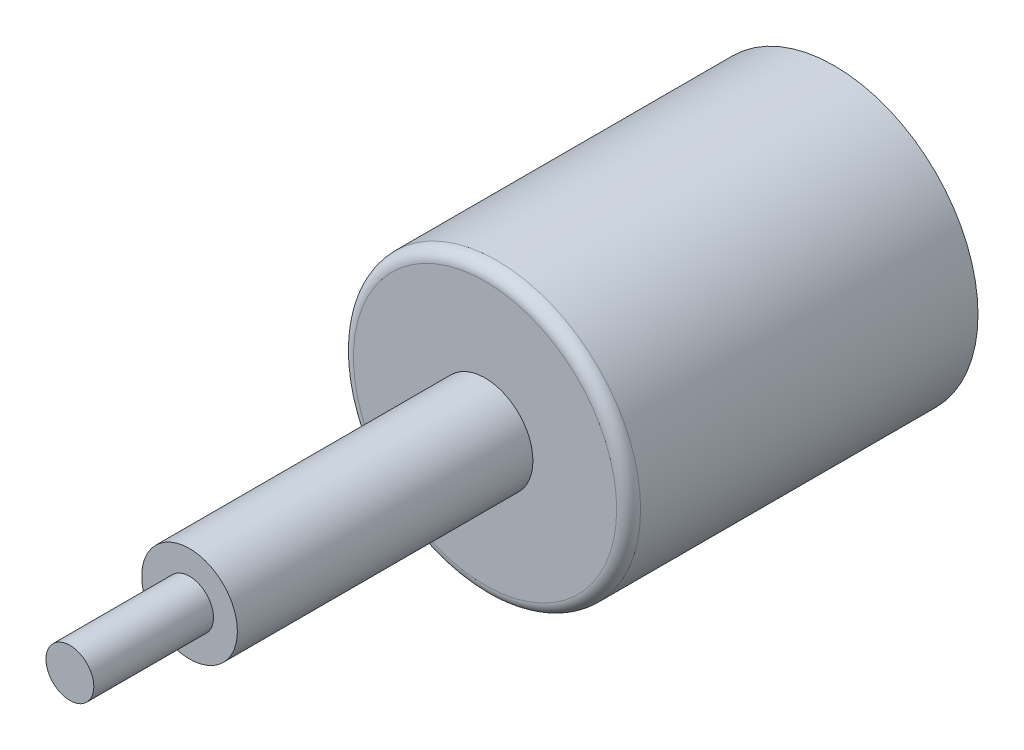
ISO-10303-21;
HEADER;
FILE_DESCRIPTION(('STEP AP214'),'2;1');
FILE_NAME('part.step','',(''),(''),'','','');
FILE_SCHEMA(('AUTOMOTIVE_DESIGN { 1 0 10303 214 1 1 1 1 }'));
ENDSEC;
DATA;
#1=APPLICATION_CONTEXT('core data for automotive mechanical design processes');
#2=APPLICATION_PROTOCOL_DEFINITION('international standard','automotive_design',2000,#1);
#3=PRODUCT_CONTEXT('',#1,'mechanical');
#4=PRODUCT('Part','Part','',(#3));
#5=PRODUCT_RELATED_PRODUCT_CATEGORY('part','',(#4));
#6=PRODUCT_DEFINITION_FORMATION('','',#4);
#7=PRODUCT_DEFINITION_CONTEXT('part definition',#1,'design');
#8=PRODUCT_DEFINITION('design','',#6,#7);
#9=PRODUCT_DEFINITION_SHAPE('','',#8);
#10=(LENGTH_UNIT() NAMED_UNIT(*) SI_UNIT(.MILLI.,.METRE.));
#11=(NAMED_UNIT(*) PLANE_ANGLE_UNIT() SI_UNIT($,.RADIAN.));
#12=(NAMED_UNIT(*) SI_UNIT($,.STERADIAN.) SOLID_ANGLE_UNIT());
#13=UNCERTAINTY_MEASURE_WITH_UNIT(LENGTH_MEASURE(1.E-05),#10,'distance_accuracy_value','');
#14=(GEOMETRIC_REPRESENTATION_CONTEXT(3) GLOBAL_UNCERTAINTY_ASSIGNED_CONTEXT((#13)) GLOBAL_UNIT_ASSIGNED_CONTEXT((#10,
#11,#12)) REPRESENTATION_CONTEXT('',''));
#15=CARTESIAN_POINT('',(0.,0.,0.));
#16=DIRECTION('',(0.,0.,1.));
#17=DIRECTION('',(1.,0.,0.));
#18=AXIS2_PLACEMENT_3D('',#15,#16,#17);
#19=CARTESIAN_POINT('',(0.,0.,53.9));
#20=DIRECTION('',(0.,0.,1.));
#21=DIRECTION('',(1.,0.,0.));
#22=AXIS2_PLACEMENT_3D('',#19,#20,#21);
#23=PLANE('',#22);
#24=CARTESIAN_POINT('',(0.,0.,53.9));
#25=DIRECTION('',(0.,0.,1.));
#26=DIRECTION('',(1.,0.,0.));
#27=AXIS2_PLACEMENT_3D('',#24,#25,#26);
#28=CIRCLE('',#27,4.);
#29=CARTESIAN_POINT('',(4.,0.,53.9));
#30=VERTEX_POINT('',#29);
#31=EDGE_CURVE('E45',#30,#30,#28,.T.);
#32=ORIENTED_EDGE('',*,*,#31,.T.);
#33=EDGE_LOOP('',(#32));
#34=FACE_BOUND('',#33,.T.);
#35=CARTESIAN_POINT('',(0.,0.,53.9));
#36=DIRECTION('',(0.,0.,1.));
#37=DIRECTION('',(1.,0.,0.));
#38=AXIS2_PLACEMENT_3D('',#35,#36,#37);
#39=CIRCLE('',#38,2.);
#40=CARTESIAN_POINT('',(2.,0.,53.9));
#41=VERTEX_POINT('',#40);
#42=EDGE_CURVE('E54',#41,#41,#39,.T.);
#43=ORIENTED_EDGE('',*,*,#42,.F.);
#44=EDGE_LOOP('',(#43));
#45=FACE_BOUND('',#44,.T.);
#46=ADVANCED_FACE('F30',(#34,#45),#23,.T.);
#47=CARTESIAN_POINT('',(0.,0.,29.2));
#48=DIRECTION('',(0.,0.,1.));
#49=DIRECTION('',(1.,0.,0.));
#50=AXIS2_PLACEMENT_3D('',#47,#48,#49);
#51=PLANE('',#50);
#52=CARTESIAN_POINT('',(0.,0.,29.2));
#53=DIRECTION('',(0.,0.,1.));
#54=DIRECTION('',(1.,0.,0.));
#55=AXIS2_PLACEMENT_3D('',#52,#53,#54);
#56=CIRCLE('',#55,11.);
#57=CARTESIAN_POINT('',(11.,0.,29.2));
#58=VERTEX_POINT('',#57);
#59=EDGE_CURVE('E37',#58,#58,#56,.T.);
#60=ORIENTED_EDGE('',*,*,#59,.T.);
#61=EDGE_LOOP('',(#60));
#62=FACE_BOUND('',#61,.T.);
#63=CARTESIAN_POINT('',(0.,0.,29.2));
#64=DIRECTION('',(0.,0.,1.));
#65=DIRECTION('',(1.,0.,0.));
#66=AXIS2_PLACEMENT_3D('',#63,#64,#65);
#67=CIRCLE('',#66,4.);
#68=CARTESIAN_POINT('',(4.,0.,29.2));
#69=VERTEX_POINT('',#68);
#70=EDGE_CURVE('E48',#69,#69,#67,.T.);
#71=ORIENTED_EDGE('',*,*,#70,.F.);
#72=EDGE_LOOP('',(#71));
#73=FACE_BOUND('',#72,.T.);
#74=ADVANCED_FACE('F70',(#62,#73),#51,.T.);
#75=CARTESIAN_POINT('',(0.,0.,29.2));
#76=DIRECTION('',(0.,0.,-1.));
#77=DIRECTION('',(-1.,0.,0.));
#78=AXIS2_PLACEMENT_3D('',#75,#76,#77);
#79=CYLINDRICAL_SURFACE('',#78,12.);
#80=CARTESIAN_POINT('',(0.,0.,28.2));
#81=DIRECTION('',(0.,0.,1.));
#82=DIRECTION('',(1.,0.,0.));
#83=AXIS2_PLACEMENT_3D('',#80,#81,#82);
#84=CIRCLE('',#83,12.);
#85=CARTESIAN_POINT('',(12.,0.,28.2));
#86=VERTEX_POINT('',#85);
#87=EDGE_CURVE('E10',#86,#86,#84,.F.);
#88=ORIENTED_EDGE('',*,*,#87,.T.);
#89=EDGE_LOOP('',(#88));
#90=FACE_BOUND('',#89,.T.);
#91=CARTESIAN_POINT('',(0.,0.,0.));
#92=DIRECTION('',(0.,0.,1.));
#93=DIRECTION('',(1.,0.,0.));
#94=AXIS2_PLACEMENT_3D('',#91,#92,#93);
#95=CIRCLE('',#94,12.);
#96=CARTESIAN_POINT('',(12.,0.,0.));
#97=VERTEX_POINT('',#96);
#98=EDGE_CURVE('E41',#97,#97,#95,.T.);
#99=ORIENTED_EDGE('',*,*,#98,.T.);
#100=EDGE_LOOP('',(#99));
#101=FACE_BOUND('',#100,.T.);
#102=ADVANCED_FACE('F76',(#90,#101),#79,.T.);
#103=CARTESIAN_POINT('',(0.,0.,0.));
#104=DIRECTION('',(0.,0.,1.));
#105=DIRECTION('',(1.,0.,0.));
#106=AXIS2_PLACEMENT_3D('',#103,#104,#105);
#107=PLANE('',#106);
#108=ORIENTED_EDGE('',*,*,#98,.F.);
#109=EDGE_LOOP('',(#108));
#110=FACE_BOUND('',#109,.T.);
#111=ADVANCED_FACE('F83',(#110),#107,.F.);
#112=CARTESIAN_POINT('',(0.,0.,28.2));
#113=DIRECTION('',(0.,0.,1.));
#114=DIRECTION('',(1.,0.,0.));
#115=AXIS2_PLACEMENT_3D('',#112,#113,#114);
#116=TOROIDAL_SURFACE('',#115,11.,1.);
#117=ORIENTED_EDGE('',*,*,#87,.F.);
#118=EDGE_LOOP('',(#117));
#119=FACE_BOUND('',#118,.T.);
#120=ORIENTED_EDGE('',*,*,#59,.F.);
#121=EDGE_LOOP('',(#120));
#122=FACE_BOUND('',#121,.T.);
#123=ADVANCED_FACE('F32',(#119,#122),#116,.T.);
#124=CARTESIAN_POINT('',(0.,0.,53.9));
#125=DIRECTION('',(0.,0.,-1.));
#126=DIRECTION('',(-1.,0.,0.));
#127=AXIS2_PLACEMENT_3D('',#124,#125,#126);
#128=CYLINDRICAL_SURFACE('',#127,4.);
#129=ORIENTED_EDGE('',*,*,#31,.F.);
#130=EDGE_LOOP('',(#129));
#131=FACE_BOUND('',#130,.T.);
#132=ORIENTED_EDGE('',*,*,#70,.T.);
#133=EDGE_LOOP('',(#132));
#134=FACE_BOUND('',#133,.T.);
#135=ADVANCED_FACE('F65',(#131,#134),#128,.T.);
#136=CARTESIAN_POINT('',(0.,0.,63.9));
#137=DIRECTION('',(0.,0.,-1.));
#138=DIRECTION('',(-1.,0.,0.));
#139=AXIS2_PLACEMENT_3D('',#136,#137,#138);
#140=CYLINDRICAL_SURFACE('',#139,2.);
#141=CARTESIAN_POINT('',(0.,0.,63.9));
#142=DIRECTION('',(0.,0.,1.));
#143=DIRECTION('',(1.,0.,0.));
#144=AXIS2_PLACEMENT_3D('',#141,#142,#143);
#145=CIRCLE('',#144,2.);
#146=CARTESIAN_POINT('',(2.,0.,63.9));
#147=VERTEX_POINT('',#146);
#148=EDGE_CURVE('E51',#147,#147,#145,.T.);
#149=ORIENTED_EDGE('',*,*,#148,.F.);
#150=EDGE_LOOP('',(#149));
#151=FACE_BOUND('',#150,.T.);
#152=ORIENTED_EDGE('',*,*,#42,.T.);
#153=EDGE_LOOP('',(#152));
#154=FACE_BOUND('',#153,.T.);
#155=ADVANCED_FACE('F62',(#151,#154),#140,.T.);
#156=CARTESIAN_POINT('',(0.,0.,63.9));
#157=DIRECTION('',(0.,0.,1.));
#158=DIRECTION('',(1.,0.,0.));
#159=AXIS2_PLACEMENT_3D('',#156,#157,#158);
#160=PLANE('',#159);
#161=ORIENTED_EDGE('',*,*,#148,.T.);
#162=EDGE_LOOP('',(#161));
#163=FACE_BOUND('',#162,.T.);
#164=ADVANCED_FACE('F60',(#163),#160,.T.);
#165=CLOSED_SHELL('',(#46,#74,#102,#111,#123,#135,#155,#164));
#166=MANIFOLD_SOLID_BREP('B2',#165);
#167=ADVANCED_BREP_SHAPE_REPRESENTATION('',(#18,#166),#14);
#168=SHAPE_DEFINITION_REPRESENTATION(#9,#167);
ENDSEC;
END-ISO-10303-21;
